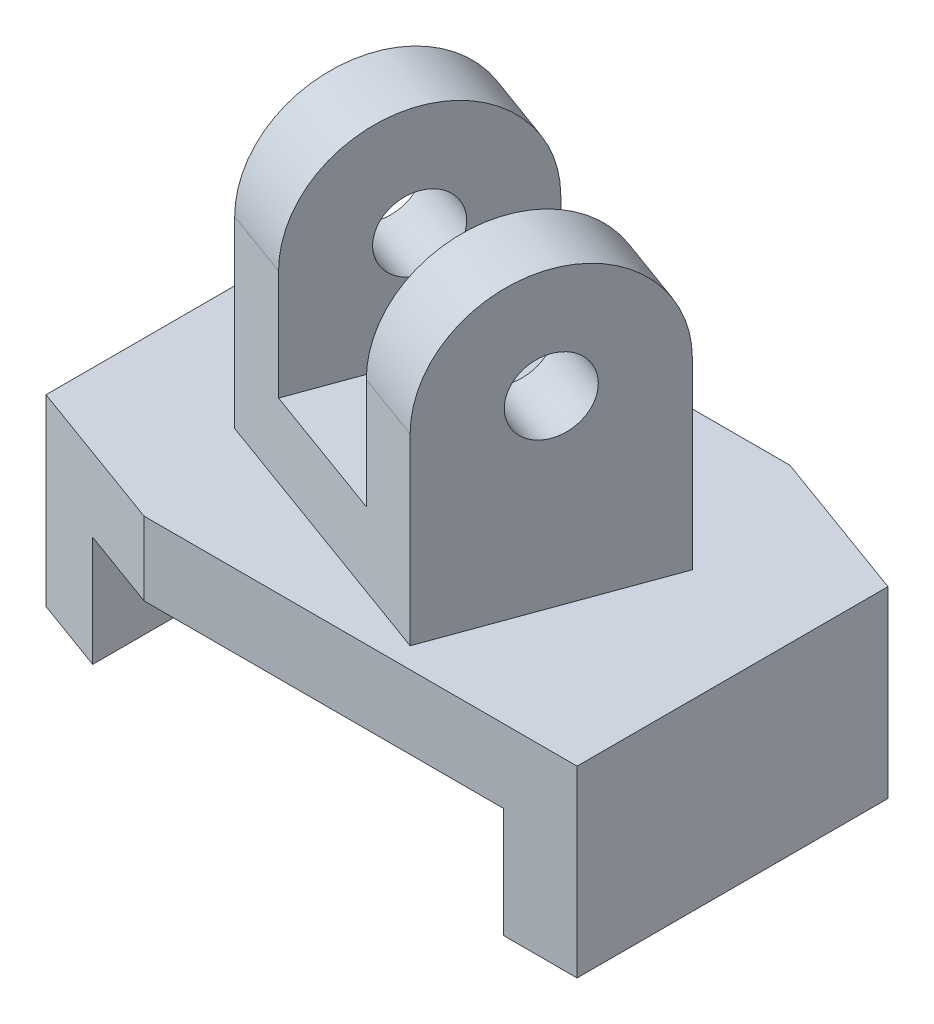
ISO-10303-21;
HEADER;
FILE_DESCRIPTION(('STEP AP214'),'2;1');
FILE_NAME('part.step','',(''),(''),'','','');
FILE_SCHEMA(('AUTOMOTIVE_DESIGN { 1 0 10303 214 1 1 1 1 }'));
ENDSEC;
DATA;
#1=APPLICATION_CONTEXT('core data for automotive mechanical design processes');
#2=APPLICATION_PROTOCOL_DEFINITION('international standard','automotive_design',2000,#1);
#3=PRODUCT_CONTEXT('',#1,'mechanical');
#4=PRODUCT('Part','Part','',(#3));
#5=PRODUCT_RELATED_PRODUCT_CATEGORY('part','',(#4));
#6=PRODUCT_DEFINITION_FORMATION('','',#4);
#7=PRODUCT_DEFINITION_CONTEXT('part definition',#1,'design');
#8=PRODUCT_DEFINITION('design','',#6,#7);
#9=PRODUCT_DEFINITION_SHAPE('','',#8);
#10=(LENGTH_UNIT() NAMED_UNIT(*) SI_UNIT(.MILLI.,.METRE.));
#11=(NAMED_UNIT(*) PLANE_ANGLE_UNIT() SI_UNIT($,.RADIAN.));
#12=(NAMED_UNIT(*) SI_UNIT($,.STERADIAN.) SOLID_ANGLE_UNIT());
#13=UNCERTAINTY_MEASURE_WITH_UNIT(LENGTH_MEASURE(1.E-05),#10,'distance_accuracy_value','');
#14=(GEOMETRIC_REPRESENTATION_CONTEXT(3) GLOBAL_UNCERTAINTY_ASSIGNED_CONTEXT((#13)) GLOBAL_UNIT_ASSIGNED_CONTEXT((#10,
#11,#12)) REPRESENTATION_CONTEXT('',''));
#15=CARTESIAN_POINT('',(0.,0.,0.));
#16=DIRECTION('',(0.,0.,1.));
#17=DIRECTION('',(1.,0.,0.));
#18=AXIS2_PLACEMENT_3D('',#15,#16,#17);
#19=CARTESIAN_POINT('',(-43.6638355049585,25.,-14.9336946815306));
#20=DIRECTION('',(0.939692620785907,0.,0.342020143325673));
#21=DIRECTION('',(0.342020143325673,0.,-0.939692620785907));
#22=AXIS2_PLACEMENT_3D('',#19,#20,#21);
#23=CYLINDRICAL_SURFACE('',#22,15.);
#24=CARTESIAN_POINT('',(-8.63546168126096,25.,-2.18440925495511));
#25=DIRECTION('',(-0.93969262078591,0.,-0.342020143325663));
#26=DIRECTION('',(-0.342020143325663,0.,0.939692620785911));
#27=AXIS2_PLACEMENT_3D('',#24,#25,#26);
#28=CIRCLE('',#27,15.);
#29=CARTESIAN_POINT('',(-3.50515953137601,25.,-16.2797985667438));
#30=VERTEX_POINT('',#29);
#31=CARTESIAN_POINT('',(-13.765763831146,25.,11.9109800568338));
#32=VERTEX_POINT('',#31);
#33=EDGE_CURVE('E203',#30,#32,#28,.F.);
#34=ORIENTED_EDGE('',*,*,#33,.F.);
#35=DIRECTION('',(0.939692620785907,0.,0.342020143325673));
#36=VECTOR('',#35,1.);
#37=CARTESIAN_POINT('',(-38.5335333550734,25.,-29.0290839933192));
#38=LINE('',#37,#36);
#39=CARTESIAN_POINT('',(-12.9020857392348,25.,-19.7000000000004));
#40=VERTEX_POINT('',#39);
#41=EDGE_CURVE('E231',#40,#30,#38,.T.);
#42=ORIENTED_EDGE('',*,*,#41,.F.);
#43=CARTESIAN_POINT('',(-18.0323878891199,25.,-5.60461068821179));
#44=DIRECTION('',(0.939692620785907,0.,0.342020143325672));
#45=DIRECTION('',(0.342020143325672,0.,-0.939692620785907));
#46=AXIS2_PLACEMENT_3D('',#43,#44,#45);
#47=CIRCLE('',#46,15.);
#48=CARTESIAN_POINT('',(-23.162690039005,25.,8.49077862357681));
#49=VERTEX_POINT('',#48);
#50=EDGE_CURVE('E240',#40,#49,#47,.T.);
#51=ORIENTED_EDGE('',*,*,#50,.T.);
#52=DIRECTION('',(0.939692620785907,0.,0.342020143325673));
#53=VECTOR('',#52,1.);
#54=CARTESIAN_POINT('',(-48.7941376548436,25.,-0.838305369741981));
#55=LINE('',#54,#53);
#56=EDGE_CURVE('E238',#49,#32,#55,.T.);
#57=ORIENTED_EDGE('',*,*,#56,.T.);
#58=EDGE_LOOP('',(#34,#42,#51,#57));
#59=FACE_BOUND('',#58,.T.);
#60=ADVANCED_FACE('F60',(#59),#23,.T.);
#61=CARTESIAN_POINT('',(-43.6638355049585,25.,-14.9336946815306));
#62=DIRECTION('',(0.939692620785907,0.,0.342020143325673));
#63=DIRECTION('',(0.342020143325673,0.,-0.939692620785907));
#64=AXIS2_PLACEMENT_3D('',#61,#62,#63);
#65=CYLINDRICAL_SURFACE('',#64,5.);
#66=CARTESIAN_POINT('',(-8.63546168126096,25.,-2.18440925495511));
#67=DIRECTION('',(-0.93969262078591,0.,-0.342020143325663));
#68=DIRECTION('',(-0.342020143325663,0.,0.939692620785911));
#69=AXIS2_PLACEMENT_3D('',#66,#67,#68);
#70=CIRCLE('',#69,5.);
#71=CARTESIAN_POINT('',(-6.92536096463264,25.,-6.88287235888466));
#72=VERTEX_POINT('',#71);
#73=EDGE_CURVE('E220',#72,#72,#70,.F.);
#74=CARTESIAN_POINT('',(-18.0323878891199,25.,-5.60461068821179));
#75=DIRECTION('',(0.939692620785907,0.,0.342020143325672));
#76=DIRECTION('',(0.342020143325672,0.,-0.939692620785907));
#77=AXIS2_PLACEMENT_3D('',#74,#75,#76);
#78=CIRCLE('',#77,5.);
#79=CARTESIAN_POINT('',(-16.3222871724915,25.,-10.3030737921413));
#80=VERTEX_POINT('',#79);
#81=EDGE_CURVE('E227',#80,#80,#78,.T.);
#82=CARTESIAN_POINT('',(-6.92536096463264,25.,-6.88287235888466));
#83=CARTESIAN_POINT('',(-7.02324561263117,25.,-6.91849945714775));
#84=CARTESIAN_POINT('',(-7.1211302606297,25.,-6.95412655541085));
#85=CARTESIAN_POINT('',(-7.31689955662676,25.,-7.02538075193703));
#86=CARTESIAN_POINT('',(-7.41478420462529,25.,-7.06100785020012));
#87=CARTESIAN_POINT('',(-7.61055350062235,25.,-7.1322620467263));
#88=CARTESIAN_POINT('',(-7.70843814862088,25.,-7.16788914498939));
#89=CARTESIAN_POINT('',(-7.90420744461794,25.,-7.23914334151557));
#90=CARTESIAN_POINT('',(-8.00209209261647,25.,-7.27477043977866));
#91=CARTESIAN_POINT('',(-8.19786138861353,25.,-7.34602463630484));
#92=CARTESIAN_POINT('',(-8.29574603661206,25.,-7.38165173456793));
#93=CARTESIAN_POINT('',(-8.49151533260912,25.,-7.45290593109411));
#94=CARTESIAN_POINT('',(-8.58939998060765,25.,-7.4885330293572));
#95=CARTESIAN_POINT('',(-8.78516927660471,25.,-7.55978722588338));
#96=CARTESIAN_POINT('',(-8.88305392460324,25.,-7.59541432414647));
#97=CARTESIAN_POINT('',(-9.0788232206003,25.,-7.66666852067265));
#98=CARTESIAN_POINT('',(-9.17670786859884,25.,-7.70229561893574));
#99=CARTESIAN_POINT('',(-9.3724771645959,25.,-7.77354981546192));
#100=CARTESIAN_POINT('',(-9.47036181259443,25.,-7.80917691372501));
#101=CARTESIAN_POINT('',(-9.66613110859148,25.,-7.88043111025119));
#102=CARTESIAN_POINT('',(-9.76401575659001,25.,-7.91605820851428));
#103=CARTESIAN_POINT('',(-9.95978505258707,25.,-7.98731240504046));
#104=CARTESIAN_POINT('',(-10.0576697005856,25.,-8.02293950330355));
#105=CARTESIAN_POINT('',(-10.2534389965827,25.,-8.09419369982973));
#106=CARTESIAN_POINT('',(-10.3513236445812,25.,-8.12982079809282));
#107=CARTESIAN_POINT('',(-10.5470929405783,25.,-8.201074994619));
#108=CARTESIAN_POINT('',(-10.6449775885768,25.,-8.23670209288209));
#109=CARTESIAN_POINT('',(-10.8407468845738,25.,-8.30795628940827));
#110=CARTESIAN_POINT('',(-10.9386315325724,25.,-8.34358338767136));
#111=CARTESIAN_POINT('',(-11.1344008285694,25.,-8.41483758419754));
#112=CARTESIAN_POINT('',(-11.232285476568,25.,-8.45046468246063));
#113=CARTESIAN_POINT('',(-11.428054772565,25.,-8.52171887898682));
#114=CARTESIAN_POINT('',(-11.5259394205636,25.,-8.55734597724991));
#115=CARTESIAN_POINT('',(-11.7217087165606,25.,-8.62860017377609));
#116=CARTESIAN_POINT('',(-11.8195933645591,25.,-8.66422727203918));
#117=CARTESIAN_POINT('',(-12.0153626605562,25.,-8.73548146856536));
#118=CARTESIAN_POINT('',(-12.1132473085547,25.,-8.77110856682845));
#119=CARTESIAN_POINT('',(-12.3090166045518,25.,-8.84236276335463));
#120=CARTESIAN_POINT('',(-12.4069012525503,25.,-8.87798986161772));
#121=CARTESIAN_POINT('',(-12.6026705485474,25.,-8.9492440581439));
#122=CARTESIAN_POINT('',(-12.7005551965459,25.,-8.98487115640699));
#123=CARTESIAN_POINT('',(-12.896324492543,25.,-9.05612535293317));
#124=CARTESIAN_POINT('',(-12.9942091405415,25.,-9.09175245119626));
#125=CARTESIAN_POINT('',(-13.1899784365386,25.,-9.16300664772244));
#126=CARTESIAN_POINT('',(-13.2878630845371,25.,-9.19863374598553));
#127=CARTESIAN_POINT('',(-13.4836323805342,25.,-9.26988794251171));
#128=CARTESIAN_POINT('',(-13.5815170285327,25.,-9.3055150407748));
#129=CARTESIAN_POINT('',(-13.7772863245297,25.,-9.37676923730098));
#130=CARTESIAN_POINT('',(-13.8751709725283,25.,-9.41239633556407));
#131=CARTESIAN_POINT('',(-14.0709402685253,25.,-9.48365053209025));
#132=CARTESIAN_POINT('',(-14.1688249165239,25.,-9.51927763035334));
#133=CARTESIAN_POINT('',(-14.3645942125209,25.,-9.59053182687952));
#134=CARTESIAN_POINT('',(-14.4624788605195,25.,-9.62615892514261));
#135=CARTESIAN_POINT('',(-14.6582481565165,25.,-9.69741312166879));
#136=CARTESIAN_POINT('',(-14.756132804515,25.,-9.73304021993188));
#137=CARTESIAN_POINT('',(-14.9519021005121,25.,-9.80429441645806));
#138=CARTESIAN_POINT('',(-15.0497867485106,25.,-9.83992151472115));
#139=CARTESIAN_POINT('',(-15.2455560445077,25.,-9.91117571124733));
#140=CARTESIAN_POINT('',(-15.3434406925062,25.,-9.94680280951042));
#141=CARTESIAN_POINT('',(-15.5392099885033,25.,-10.0180570060366));
#142=CARTESIAN_POINT('',(-15.6370946365018,25.,-10.0536841042997));
#143=CARTESIAN_POINT('',(-15.8328639324989,25.,-10.1249383008259));
#144=CARTESIAN_POINT('',(-15.9307485804974,25.,-10.160565399089));
#145=CARTESIAN_POINT('',(-16.1265178764945,25.,-10.2318195956151));
#146=CARTESIAN_POINT('',(-16.224402524493,25.,-10.2674466938782));
#147=CARTESIAN_POINT('',(-16.3222871724915,25.,-10.3030737921413));
#148=B_SPLINE_CURVE_WITH_KNOTS('',3,(#82,#83,#84,#85,#86,#87,#88,#89,#90,#91,#92,#93,#94,#95,
#96,#97,#98,#99,#100,#101,#102,#103,#104,#105,#106,#107,#108,#109,#110,#111,#112,#113,#114,#115,
#116,#117,#118,#119,#120,#121,#122,#123,#124,#125,#126,#127,#128,#129,#130,#131,#132,#133,#134,
#135,#136,#137,#138,#139,#140,#141,#142,#143,#144,#145,#146,#147),.UNSPECIFIED.,.F.,.F.,(4,2,2,
2,2,2,2,2,2,2,2,2,2,2,2,2,2,2,2,2,2,2,2,2,2,2,2,2,2,2,2,2,4),(0.,0.312499999999992,
0.624999999999984,0.937499999999975,1.24999999999997,1.56249999999996,1.87499999999996,
2.18749999999996,2.49999999999995,2.81249999999995,3.12499999999994,3.43749999999993,
3.74999999999993,4.06249999999992,4.37499999999991,4.6874999999999,4.9999999999999,
5.3124999999999,5.62499999999989,5.93749999999988,6.24999999999988,6.56249999999987,
6.87499999999986,7.18749999999985,7.49999999999985,7.81249999999985,8.12499999999984,
8.43749999999983,8.74999999999983,9.06249999999982,9.37499999999982,9.68749999999981,
9.9999999999998),.UNSPECIFIED.);
#149=EDGE_CURVE('BSEAM335',#72,#80,#148,.T.);
#150=ORIENTED_EDGE('',*,*,#73,.T.);
#151=ORIENTED_EDGE('',*,*,#81,.F.);
#152=ORIENTED_EDGE('',*,*,#149,.T.);
#153=ORIENTED_EDGE('',*,*,#149,.F.);
#154=EDGE_LOOP('',(#150,#152,#151,#153));
#155=FACE_BOUND('',#154,.T.);
#156=ADVANCED_FACE('F335',(#155),#65,.F.);
#157=CARTESIAN_POINT('',(-23.1626900390051,40.,8.49077862357721));
#158=DIRECTION('',(0.939692620785907,0.,0.342020143325672));
#159=DIRECTION('',(0.342020143325672,0.,-0.939692620785907));
#160=AXIS2_PLACEMENT_3D('',#157,#158,#159);
#161=PLANE('',#160);
#162=ORIENTED_EDGE('',*,*,#81,.T.);
#163=EDGE_LOOP('',(#162));
#164=FACE_BOUND('',#163,.T.);
#165=ORIENTED_EDGE('',*,*,#50,.F.);
#166=DIRECTION('',(0.,-1.,0.));
#167=VECTOR('',#166,1.);
#168=CARTESIAN_POINT('',(-12.9020857392349,40.,-19.7));
#169=LINE('',#168,#167);
#170=CARTESIAN_POINT('',(-12.9020857392349,0.,-19.7));
#171=VERTEX_POINT('',#170);
#172=EDGE_CURVE('E252',#40,#171,#169,.T.);
#173=ORIENTED_EDGE('',*,*,#172,.T.);
#174=DIRECTION('',(-0.342020143325672,0.,0.939692620785907));
#175=VECTOR('',#174,1.);
#176=CARTESIAN_POINT('',(-23.1626900390051,0.,8.49077862357721));
#177=LINE('',#176,#175);
#178=CARTESIAN_POINT('',(-23.1626900390051,0.,8.49077862357721));
#179=VERTEX_POINT('',#178);
#180=EDGE_CURVE('E242',#171,#179,#177,.T.);
#181=ORIENTED_EDGE('',*,*,#180,.T.);
#182=DIRECTION('',(0.,-1.,0.));
#183=VECTOR('',#182,1.);
#184=CARTESIAN_POINT('',(-23.1626900390051,40.,8.49077862357721));
#185=LINE('',#184,#183);
#186=EDGE_CURVE('E257',#49,#179,#185,.T.);
#187=ORIENTED_EDGE('',*,*,#186,.F.);
#188=EDGE_LOOP('',(#165,#173,#181,#187));
#189=FACE_BOUND('',#188,.T.);
#190=ADVANCED_FACE('F357',(#164,#189),#161,.F.);
#191=CARTESIAN_POINT('',(24.6856190922015,40.,-6.01919426697349));
#192=DIRECTION('',(-0.939692620785907,0.,-0.342020143325673));
#193=DIRECTION('',(-0.342020143325673,0.,0.939692620785907));
#194=AXIS2_PLACEMENT_3D('',#191,#192,#193);
#195=PLANE('',#194);
#196=CARTESIAN_POINT('',(19.5553169423164,25.,8.07619504481512));
#197=DIRECTION('',(0.939692620785907,0.,0.342020143325673));
#198=DIRECTION('',(0.342020143325673,0.,-0.939692620785907));
#199=AXIS2_PLACEMENT_3D('',#196,#197,#198);
#200=CIRCLE('',#199,5.);
#201=CARTESIAN_POINT('',(21.2654176589448,25.,3.37773194088559));
#202=VERTEX_POINT('',#201);
#203=EDGE_CURVE('E224',#202,#202,#200,.T.);
#204=ORIENTED_EDGE('',*,*,#203,.F.);
#205=EDGE_LOOP('',(#204));
#206=FACE_BOUND('',#205,.T.);
#207=DIRECTION('',(0.,-1.,0.));
#208=VECTOR('',#207,1.);
#209=CARTESIAN_POINT('',(24.6856190922015,40.,-6.01919426697349));
#210=LINE('',#209,#208);
#211=CARTESIAN_POINT('',(24.6856190922015,25.,-6.01919426697349));
#212=VERTEX_POINT('',#211);
#213=CARTESIAN_POINT('',(24.6856190922015,0.,-6.01919426697349));
#214=VERTEX_POINT('',#213);
#215=EDGE_CURVE('E75',#212,#214,#210,.T.);
#216=ORIENTED_EDGE('',*,*,#215,.F.);
#217=CARTESIAN_POINT('',(19.5553169423164,25.,8.07619504481512));
#218=DIRECTION('',(0.939692620785907,0.,0.342020143325673));
#219=DIRECTION('',(0.342020143325673,0.,-0.939692620785907));
#220=AXIS2_PLACEMENT_3D('',#217,#218,#219);
#221=CIRCLE('',#220,15.);
#222=CARTESIAN_POINT('',(14.4250147924313,25.,22.1715843566037));
#223=VERTEX_POINT('',#222);
#224=EDGE_CURVE('E234',#212,#223,#221,.T.);
#225=ORIENTED_EDGE('',*,*,#224,.T.);
#226=DIRECTION('',(0.,-1.,0.));
#227=VECTOR('',#226,1.);
#228=CARTESIAN_POINT('',(14.4250147924313,40.,22.1715843566037));
#229=LINE('',#228,#227);
#230=CARTESIAN_POINT('',(14.4250147924313,0.,22.1715843566037));
#231=VERTEX_POINT('',#230);
#232=EDGE_CURVE('E255',#223,#231,#229,.T.);
#233=ORIENTED_EDGE('',*,*,#232,.T.);
#234=DIRECTION('',(0.342020143325673,0.,-0.939692620785907));
#235=VECTOR('',#234,1.);
#236=CARTESIAN_POINT('',(24.6856190922015,0.,-6.01919426697349));
#237=LINE('',#236,#235);
#238=EDGE_CURVE('E248',#231,#214,#237,.T.);
#239=ORIENTED_EDGE('',*,*,#238,.T.);
#240=EDGE_LOOP('',(#216,#225,#233,#239));
#241=FACE_BOUND('',#240,.T.);
#242=ADVANCED_FACE('F376',(#206,#241),#195,.F.);
#243=CARTESIAN_POINT('',(14.4250147924313,40.,22.1715843566037));
#244=DIRECTION('',(0.342020143325663,0.,-0.93969262078591));
#245=DIRECTION('',(-0.939692620785911,0.,-0.342020143325663));
#246=AXIS2_PLACEMENT_3D('',#243,#244,#245);
#247=PLANE('',#246);
#248=DIRECTION('',(0.93969262078591,0.,0.342020143325663));
#249=VECTOR('',#248,1.);
#250=CARTESIAN_POINT('',(-13.765763831146,10.,11.9109800568338));
#251=LINE('',#250,#249);
#252=CARTESIAN_POINT('',(-13.765763831146,10.,11.9109800568338));
#253=VERTEX_POINT('',#252);
#254=CARTESIAN_POINT('',(5.0280885845722,10.,18.7513829233471));
#255=VERTEX_POINT('',#254);
#256=EDGE_CURVE('E192',#253,#255,#251,.T.);
#257=ORIENTED_EDGE('',*,*,#256,.F.);
#258=DIRECTION('',(0.,-1.,0.));
#259=VECTOR('',#258,1.);
#260=CARTESIAN_POINT('',(-13.765763831146,40.,11.9109800568338));
#261=LINE('',#260,#259);
#262=EDGE_CURVE('E201',#32,#253,#261,.T.);
#263=ORIENTED_EDGE('',*,*,#262,.F.);
#264=ORIENTED_EDGE('',*,*,#56,.F.);
#265=ORIENTED_EDGE('',*,*,#186,.T.);
#266=DIRECTION('',(0.93969262078591,0.,0.342020143325663));
#267=VECTOR('',#266,1.);
#268=CARTESIAN_POINT('',(14.4250147924313,0.,22.1715843566037));
#269=LINE('',#268,#267);
#270=EDGE_CURVE('E245',#179,#231,#269,.T.);
#271=ORIENTED_EDGE('',*,*,#270,.T.);
#272=ORIENTED_EDGE('',*,*,#232,.F.);
#273=CARTESIAN_POINT('',(5.0280885845722,25.,18.7513829233471));
#274=VERTEX_POINT('',#273);
#275=EDGE_CURVE('E237',#274,#223,#55,.T.);
#276=ORIENTED_EDGE('',*,*,#275,.F.);
#277=DIRECTION('',(0.,1.,0.));
#278=VECTOR('',#277,1.);
#279=CARTESIAN_POINT('',(5.02808858457219,40.,18.7513829233471));
#280=LINE('',#279,#278);
#281=EDGE_CURVE('E198',#255,#274,#280,.T.);
#282=ORIENTED_EDGE('',*,*,#281,.F.);
#283=EDGE_LOOP('',(#257,#263,#264,#265,#271,#272,#276,#282));
#284=FACE_BOUND('',#283,.T.);
#285=ADVANCED_FACE('F208',(#284),#247,.F.);
#286=CARTESIAN_POINT('',(0.,0.,0.));
#287=DIRECTION('',(0.,1.,0.));
#288=DIRECTION('',(0.,0.,1.));
#289=AXIS2_PLACEMENT_3D('',#286,#287,#288);
#290=PLANE('',#289);
#291=DIRECTION('',(0.,0.,1.));
#292=VECTOR('',#291,1.);
#293=CARTESIAN_POINT('',(-40.,0.,-25.));
#294=LINE('',#293,#292);
#295=CARTESIAN_POINT('',(-40.,0.,-25.));
#296=VERTEX_POINT('',#295);
#297=CARTESIAN_POINT('',(-40.,0.,17.3566250804099));
#298=VERTEX_POINT('',#297);
#299=EDGE_CURVE('E281',#296,#298,#294,.T.);
#300=ORIENTED_EDGE('',*,*,#299,.T.);
#301=DIRECTION('',(0.939692620785911,0.,0.342020143325663));
#302=VECTOR('',#301,1.);
#303=CARTESIAN_POINT('',(-19.,0.,25.));
#304=LINE('',#303,#302);
#305=CARTESIAN_POINT('',(-19.,0.,25.));
#306=VERTEX_POINT('',#305);
#307=EDGE_CURVE('E302',#298,#306,#304,.T.);
#308=ORIENTED_EDGE('',*,*,#307,.T.);
#309=DIRECTION('',(1.,0.,0.));
#310=VECTOR('',#309,1.);
#311=CARTESIAN_POINT('',(-19.,0.,25.));
#312=LINE('',#311,#310);
#313=CARTESIAN_POINT('',(40.,0.,25.));
#314=VERTEX_POINT('',#313);
#315=EDGE_CURVE('E305',#306,#314,#312,.T.);
#316=ORIENTED_EDGE('',*,*,#315,.T.);
#317=DIRECTION('',(0.,0.,-1.));
#318=VECTOR('',#317,1.);
#319=CARTESIAN_POINT('',(40.,0.,-17.3566250804097));
#320=LINE('',#319,#318);
#321=CARTESIAN_POINT('',(40.,0.,-17.3566250804097));
#322=VERTEX_POINT('',#321);
#323=EDGE_CURVE('E308',#314,#322,#320,.T.);
#324=ORIENTED_EDGE('',*,*,#323,.T.);
#325=DIRECTION('',(-0.939692620785908,0.,-0.342020143325669));
#326=VECTOR('',#325,1.);
#327=CARTESIAN_POINT('',(19.,0.,-25.));
#328=LINE('',#327,#326);
#329=CARTESIAN_POINT('',(19.,0.,-25.));
#330=VERTEX_POINT('',#329);
#331=EDGE_CURVE('E311',#322,#330,#328,.T.);
#332=ORIENTED_EDGE('',*,*,#331,.T.);
#333=DIRECTION('',(-1.,0.,0.));
#334=VECTOR('',#333,1.);
#335=CARTESIAN_POINT('',(-40.,0.,-25.));
#336=LINE('',#335,#334);
#337=EDGE_CURVE('E286',#330,#296,#336,.T.);
#338=ORIENTED_EDGE('',*,*,#337,.T.);
#339=EDGE_LOOP('',(#300,#308,#316,#324,#332,#338));
#340=FACE_BOUND('',#339,.T.);
#341=ORIENTED_EDGE('',*,*,#270,.F.);
#342=ORIENTED_EDGE('',*,*,#180,.F.);
#343=DIRECTION('',(-0.939692620785911,0.,-0.342020143325663));
#344=VECTOR('',#343,1.);
#345=CARTESIAN_POINT('',(-12.9020857392349,0.,-19.7));
#346=LINE('',#345,#344);
#347=EDGE_CURVE('E250',#214,#171,#346,.T.);
#348=ORIENTED_EDGE('',*,*,#347,.F.);
#349=ORIENTED_EDGE('',*,*,#238,.F.);
#350=EDGE_LOOP('',(#341,#342,#348,#349));
#351=FACE_BOUND('',#350,.T.);
#352=ADVANCED_FACE('F380',(#340,#351),#290,.T.);
#353=CARTESIAN_POINT('',(0.,-25.,0.));
#354=DIRECTION('',(0.,1.,0.));
#355=DIRECTION('',(0.,0.,1.));
#356=AXIS2_PLACEMENT_3D('',#353,#354,#355);
#357=PLANE('',#356);
#358=DIRECTION('',(1.,0.,0.));
#359=VECTOR('',#358,1.);
#360=CARTESIAN_POINT('',(-19.,-25.,25.));
#361=LINE('',#360,#359);
#362=CARTESIAN_POINT('',(30.,-25.,25.));
#363=VERTEX_POINT('',#362);
#364=CARTESIAN_POINT('',(40.,-25.,25.));
#365=VERTEX_POINT('',#364);
#366=EDGE_CURVE('E289',#363,#365,#361,.T.);
#367=ORIENTED_EDGE('',*,*,#366,.F.);
#368=DIRECTION('',(0.,0.,-1.));
#369=VECTOR('',#368,1.);
#370=CARTESIAN_POINT('',(30.,-25.,0.));
#371=LINE('',#370,#369);
#372=CARTESIAN_POINT('',(30.,-25.,-20.9963274230718));
#373=VERTEX_POINT('',#372);
#374=EDGE_CURVE('E318',#363,#373,#371,.T.);
#375=ORIENTED_EDGE('',*,*,#374,.T.);
#376=DIRECTION('',(-0.939692620785908,0.,-0.342020143325669));
#377=VECTOR('',#376,1.);
#378=CARTESIAN_POINT('',(19.,-25.,-25.));
#379=LINE('',#378,#377);
#380=CARTESIAN_POINT('',(40.,-25.,-17.3566250804097));
#381=VERTEX_POINT('',#380);
#382=EDGE_CURVE('E294',#381,#373,#379,.T.);
#383=ORIENTED_EDGE('',*,*,#382,.F.);
#384=DIRECTION('',(0.,0.,-1.));
#385=VECTOR('',#384,1.);
#386=CARTESIAN_POINT('',(40.,-25.,-17.3566250804097));
#387=LINE('',#386,#385);
#388=EDGE_CURVE('E291',#365,#381,#387,.T.);
#389=ORIENTED_EDGE('',*,*,#388,.F.);
#390=EDGE_LOOP('',(#367,#375,#383,#389));
#391=FACE_BOUND('',#390,.T.);
#392=ADVANCED_FACE('F410',(#391),#357,.F.);
#393=CARTESIAN_POINT('',(-40.,-25.,-25.));
#394=DIRECTION('',(-1.,0.,0.));
#395=DIRECTION('',(0.,0.,1.));
#396=AXIS2_PLACEMENT_3D('',#393,#394,#395);
#397=PLANE('',#396);
#398=ORIENTED_EDGE('',*,*,#299,.F.);
#399=DIRECTION('',(0.,1.,0.));
#400=VECTOR('',#399,1.);
#401=CARTESIAN_POINT('',(-40.,-25.,-25.));
#402=LINE('',#401,#400);
#403=CARTESIAN_POINT('',(-40.,-25.,-25.));
#404=VERTEX_POINT('',#403);
#405=EDGE_CURVE('E316',#404,#296,#402,.T.);
#406=ORIENTED_EDGE('',*,*,#405,.F.);
#407=DIRECTION('',(0.,0.,1.));
#408=VECTOR('',#407,1.);
#409=CARTESIAN_POINT('',(-40.,-25.,-25.));
#410=LINE('',#409,#408);
#411=CARTESIAN_POINT('',(-40.,-25.,17.3566250804099));
#412=VERTEX_POINT('',#411);
#413=EDGE_CURVE('E282',#404,#412,#410,.T.);
#414=ORIENTED_EDGE('',*,*,#413,.T.);
#415=DIRECTION('',(0.,1.,0.));
#416=VECTOR('',#415,1.);
#417=CARTESIAN_POINT('',(-40.,-25.,17.3566250804099));
#418=LINE('',#417,#416);
#419=EDGE_CURVE('E299',#412,#298,#418,.T.);
#420=ORIENTED_EDGE('',*,*,#419,.T.);
#421=EDGE_LOOP('',(#398,#406,#414,#420));
#422=FACE_BOUND('',#421,.T.);
#423=ADVANCED_FACE('F62',(#422),#397,.T.);
#424=CARTESIAN_POINT('',(-40.,-25.,-25.));
#425=DIRECTION('',(0.,0.,-1.));
#426=DIRECTION('',(-1.,0.,0.));
#427=AXIS2_PLACEMENT_3D('',#424,#425,#426);
#428=PLANE('',#427);
#429=DIRECTION('',(0.,-1.,0.));
#430=VECTOR('',#429,1.);
#431=CARTESIAN_POINT('',(-30.,-25.,-25.));
#432=LINE('',#431,#430);
#433=CARTESIAN_POINT('',(-30.,-10.,-25.));
#434=VERTEX_POINT('',#433);
#435=CARTESIAN_POINT('',(-30.,-25.,-25.));
#436=VERTEX_POINT('',#435);
#437=EDGE_CURVE('E263',#434,#436,#432,.T.);
#438=ORIENTED_EDGE('',*,*,#437,.T.);
#439=DIRECTION('',(-1.,0.,0.));
#440=VECTOR('',#439,1.);
#441=CARTESIAN_POINT('',(-40.,-25.,-25.));
#442=LINE('',#441,#440);
#443=EDGE_CURVE('E297',#436,#404,#442,.T.);
#444=ORIENTED_EDGE('',*,*,#443,.T.);
#445=ORIENTED_EDGE('',*,*,#405,.T.);
#446=ORIENTED_EDGE('',*,*,#337,.F.);
#447=DIRECTION('',(0.,1.,0.));
#448=VECTOR('',#447,1.);
#449=CARTESIAN_POINT('',(19.,-25.,-25.));
#450=LINE('',#449,#448);
#451=CARTESIAN_POINT('',(19.,-10.,-25.));
#452=VERTEX_POINT('',#451);
#453=EDGE_CURVE('E319',#452,#330,#450,.T.);
#454=ORIENTED_EDGE('',*,*,#453,.F.);
#455=DIRECTION('',(-1.,0.,0.));
#456=VECTOR('',#455,1.);
#457=CARTESIAN_POINT('',(30.,-10.,-25.));
#458=LINE('',#457,#456);
#459=EDGE_CURVE('E260',#452,#434,#458,.T.);
#460=ORIENTED_EDGE('',*,*,#459,.T.);
#461=EDGE_LOOP('',(#438,#444,#445,#446,#454,#460));
#462=FACE_BOUND('',#461,.T.);
#463=ADVANCED_FACE('F414',(#462),#428,.T.);
#464=CARTESIAN_POINT('',(19.,-25.,-25.));
#465=DIRECTION('',(0.342020143325669,0.,-0.939692620785908));
#466=DIRECTION('',(-0.939692620785908,0.,-0.342020143325669));
#467=AXIS2_PLACEMENT_3D('',#464,#465,#466);
#468=PLANE('',#467);
#469=DIRECTION('',(0.,-1.,0.));
#470=VECTOR('',#469,1.);
#471=CARTESIAN_POINT('',(30.,-25.,-20.9963274230718));
#472=LINE('',#471,#470);
#473=CARTESIAN_POINT('',(30.,-10.,-20.9963274230718));
#474=VERTEX_POINT('',#473);
#475=EDGE_CURVE('E277',#474,#373,#472,.T.);
#476=ORIENTED_EDGE('',*,*,#475,.F.);
#477=DIRECTION('',(0.939692620785908,0.,0.342020143325669));
#478=VECTOR('',#477,1.);
#479=CARTESIAN_POINT('',(19.,-10.,-25.));
#480=LINE('',#479,#478);
#481=EDGE_CURVE('E279',#452,#474,#480,.T.);
#482=ORIENTED_EDGE('',*,*,#481,.F.);
#483=ORIENTED_EDGE('',*,*,#453,.T.);
#484=ORIENTED_EDGE('',*,*,#331,.F.);
#485=DIRECTION('',(0.,1.,0.));
#486=VECTOR('',#485,1.);
#487=CARTESIAN_POINT('',(40.,-25.,-17.3566250804097));
#488=LINE('',#487,#486);
#489=EDGE_CURVE('E321',#381,#322,#488,.T.);
#490=ORIENTED_EDGE('',*,*,#489,.F.);
#491=ORIENTED_EDGE('',*,*,#382,.T.);
#492=EDGE_LOOP('',(#476,#482,#483,#484,#490,#491));
#493=FACE_BOUND('',#492,.T.);
#494=ADVANCED_FACE('F417',(#493),#468,.T.);
#495=CARTESIAN_POINT('',(40.,-25.,-17.3566250804097));
#496=DIRECTION('',(1.,0.,0.));
#497=DIRECTION('',(0.,0.,-1.));
#498=AXIS2_PLACEMENT_3D('',#495,#496,#497);
#499=PLANE('',#498);
#500=ORIENTED_EDGE('',*,*,#323,.F.);
#501=DIRECTION('',(0.,1.,0.));
#502=VECTOR('',#501,1.);
#503=CARTESIAN_POINT('',(40.,-25.,25.));
#504=LINE('',#503,#502);
#505=EDGE_CURVE('E323',#365,#314,#504,.T.);
#506=ORIENTED_EDGE('',*,*,#505,.F.);
#507=ORIENTED_EDGE('',*,*,#388,.T.);
#508=ORIENTED_EDGE('',*,*,#489,.T.);
#509=EDGE_LOOP('',(#500,#506,#507,#508));
#510=FACE_BOUND('',#509,.T.);
#511=ADVANCED_FACE('F421',(#510),#499,.T.);
#512=CARTESIAN_POINT('',(-19.,-25.,25.));
#513=DIRECTION('',(0.,0.,1.));
#514=DIRECTION('',(1.,0.,0.));
#515=AXIS2_PLACEMENT_3D('',#512,#513,#514);
#516=PLANE('',#515);
#517=DIRECTION('',(0.,1.,0.));
#518=VECTOR('',#517,1.);
#519=CARTESIAN_POINT('',(30.,-25.,25.));
#520=LINE('',#519,#518);
#521=CARTESIAN_POINT('',(30.,-10.,25.));
#522=VERTEX_POINT('',#521);
#523=EDGE_CURVE('E259',#363,#522,#520,.T.);
#524=ORIENTED_EDGE('',*,*,#523,.F.);
#525=ORIENTED_EDGE('',*,*,#366,.T.);
#526=ORIENTED_EDGE('',*,*,#505,.T.);
#527=ORIENTED_EDGE('',*,*,#315,.F.);
#528=DIRECTION('',(0.,1.,0.));
#529=VECTOR('',#528,1.);
#530=CARTESIAN_POINT('',(-19.,-25.,25.));
#531=LINE('',#530,#529);
#532=CARTESIAN_POINT('',(-19.,-10.,25.));
#533=VERTEX_POINT('',#532);
#534=EDGE_CURVE('E325',#533,#306,#531,.T.);
#535=ORIENTED_EDGE('',*,*,#534,.F.);
#536=DIRECTION('',(-1.,0.,0.));
#537=VECTOR('',#536,1.);
#538=CARTESIAN_POINT('',(30.,-10.,25.));
#539=LINE('',#538,#537);
#540=EDGE_CURVE('E264',#522,#533,#539,.T.);
#541=ORIENTED_EDGE('',*,*,#540,.F.);
#542=EDGE_LOOP('',(#524,#525,#526,#527,#535,#541));
#543=FACE_BOUND('',#542,.T.);
#544=ADVANCED_FACE('F425',(#543),#516,.T.);
#545=CARTESIAN_POINT('',(-19.,-25.,25.));
#546=DIRECTION('',(-0.342020143325663,0.,0.93969262078591));
#547=DIRECTION('',(0.939692620785911,0.,0.342020143325663));
#548=AXIS2_PLACEMENT_3D('',#545,#546,#547);
#549=PLANE('',#548);
#550=DIRECTION('',(0.,-1.,0.));
#551=VECTOR('',#550,1.);
#552=CARTESIAN_POINT('',(-30.,-25.,20.9963274230719));
#553=LINE('',#552,#551);
#554=CARTESIAN_POINT('',(-30.,-10.,20.9963274230719));
#555=VERTEX_POINT('',#554);
#556=CARTESIAN_POINT('',(-30.,-25.,20.9963274230719));
#557=VERTEX_POINT('',#556);
#558=EDGE_CURVE('E83',#555,#557,#553,.T.);
#559=ORIENTED_EDGE('',*,*,#558,.F.);
#560=DIRECTION('',(-0.939692620785911,0.,-0.342020143325663));
#561=VECTOR('',#560,1.);
#562=CARTESIAN_POINT('',(-19.,-10.,25.));
#563=LINE('',#562,#561);
#564=EDGE_CURVE('E68',#533,#555,#563,.T.);
#565=ORIENTED_EDGE('',*,*,#564,.F.);
#566=ORIENTED_EDGE('',*,*,#534,.T.);
#567=ORIENTED_EDGE('',*,*,#307,.F.);
#568=ORIENTED_EDGE('',*,*,#419,.F.);
#569=DIRECTION('',(0.939692620785911,0.,0.342020143325663));
#570=VECTOR('',#569,1.);
#571=CARTESIAN_POINT('',(-19.,-25.,25.));
#572=LINE('',#571,#570);
#573=EDGE_CURVE('E285',#412,#557,#572,.T.);
#574=ORIENTED_EDGE('',*,*,#573,.T.);
#575=EDGE_LOOP('',(#559,#565,#566,#567,#568,#574));
#576=FACE_BOUND('',#575,.T.);
#577=ADVANCED_FACE('F408',(#576),#549,.T.);
#578=ORIENTED_EDGE('',*,*,#443,.F.);
#579=DIRECTION('',(0.,0.,1.));
#580=VECTOR('',#579,1.);
#581=CARTESIAN_POINT('',(-30.,-25.,-25.));
#582=LINE('',#581,#580);
#583=EDGE_CURVE('E271',#436,#557,#582,.T.);
#584=ORIENTED_EDGE('',*,*,#583,.T.);
#585=ORIENTED_EDGE('',*,*,#573,.F.);
#586=ORIENTED_EDGE('',*,*,#413,.F.);
#587=EDGE_LOOP('',(#578,#584,#585,#586));
#588=FACE_BOUND('',#587,.T.);
#589=ADVANCED_FACE('F404',(#588),#357,.F.);
#590=CARTESIAN_POINT('',(30.,-25.,-25.));
#591=DIRECTION('',(1.,0.,0.));
#592=DIRECTION('',(0.,1.,0.));
#593=AXIS2_PLACEMENT_3D('',#590,#591,#592);
#594=PLANE('',#593);
#595=ORIENTED_EDGE('',*,*,#475,.T.);
#596=ORIENTED_EDGE('',*,*,#374,.F.);
#597=ORIENTED_EDGE('',*,*,#523,.T.);
#598=DIRECTION('',(0.,0.,1.));
#599=VECTOR('',#598,1.);
#600=CARTESIAN_POINT('',(30.,-10.,-25.));
#601=LINE('',#600,#599);
#602=EDGE_CURVE('E267',#474,#522,#601,.T.);
#603=ORIENTED_EDGE('',*,*,#602,.F.);
#604=EDGE_LOOP('',(#595,#596,#597,#603));
#605=FACE_BOUND('',#604,.T.);
#606=ADVANCED_FACE('F398',(#605),#594,.F.);
#607=CARTESIAN_POINT('',(-30.,-25.,-25.));
#608=DIRECTION('',(-1.,0.,0.));
#609=DIRECTION('',(0.,-1.,0.));
#610=AXIS2_PLACEMENT_3D('',#607,#608,#609);
#611=PLANE('',#610);
#612=ORIENTED_EDGE('',*,*,#558,.T.);
#613=ORIENTED_EDGE('',*,*,#583,.F.);
#614=ORIENTED_EDGE('',*,*,#437,.F.);
#615=DIRECTION('',(0.,0.,1.));
#616=VECTOR('',#615,1.);
#617=CARTESIAN_POINT('',(-30.,-10.,-25.));
#618=LINE('',#617,#616);
#619=EDGE_CURVE('E273',#434,#555,#618,.T.);
#620=ORIENTED_EDGE('',*,*,#619,.T.);
#621=EDGE_LOOP('',(#612,#613,#614,#620));
#622=FACE_BOUND('',#621,.T.);
#623=ADVANCED_FACE('F395',(#622),#611,.F.);
#624=CARTESIAN_POINT('',(30.,-10.,-25.));
#625=DIRECTION('',(0.,1.,0.));
#626=DIRECTION('',(-1.,0.,0.));
#627=AXIS2_PLACEMENT_3D('',#624,#625,#626);
#628=PLANE('',#627);
#629=ORIENTED_EDGE('',*,*,#481,.T.);
#630=ORIENTED_EDGE('',*,*,#602,.T.);
#631=ORIENTED_EDGE('',*,*,#540,.T.);
#632=ORIENTED_EDGE('',*,*,#564,.T.);
#633=ORIENTED_EDGE('',*,*,#619,.F.);
#634=ORIENTED_EDGE('',*,*,#459,.F.);
#635=EDGE_LOOP('',(#629,#630,#631,#632,#633,#634));
#636=FACE_BOUND('',#635,.T.);
#637=ADVANCED_FACE('F367',(#636),#628,.F.);
#638=CARTESIAN_POINT('',(-12.9020857392349,40.,-19.7));
#639=DIRECTION('',(-0.342020143325663,0.,0.939692620785911));
#640=DIRECTION('',(0.939692620785911,0.,0.342020143325663));
#641=AXIS2_PLACEMENT_3D('',#638,#639,#640);
#642=PLANE('',#641);
#643=ORIENTED_EDGE('',*,*,#41,.T.);
#644=DIRECTION('',(0.,-1.,0.));
#645=VECTOR('',#644,1.);
#646=CARTESIAN_POINT('',(-3.50515953137612,40.,-16.2797985667435));
#647=LINE('',#646,#645);
#648=CARTESIAN_POINT('',(-3.50515953137612,10.,-16.2797985667435));
#649=VERTEX_POINT('',#648);
#650=EDGE_CURVE('E222',#30,#649,#647,.T.);
#651=ORIENTED_EDGE('',*,*,#650,.T.);
#652=DIRECTION('',(0.939692620785911,0.,0.342020143325663));
#653=VECTOR('',#652,1.);
#654=CARTESIAN_POINT('',(-12.9020857392349,10.,-19.7));
#655=LINE('',#654,#653);
#656=CARTESIAN_POINT('',(15.2886928843421,10.,-9.43939570023022));
#657=VERTEX_POINT('',#656);
#658=EDGE_CURVE('E12',#649,#657,#655,.T.);
#659=ORIENTED_EDGE('',*,*,#658,.T.);
#660=DIRECTION('',(0.,1.,0.));
#661=VECTOR('',#660,1.);
#662=CARTESIAN_POINT('',(15.2886928843421,40.,-9.43939570023022));
#663=LINE('',#662,#661);
#664=CARTESIAN_POINT('',(15.2886928843421,25.,-9.43939570023032));
#665=VERTEX_POINT('',#664);
#666=EDGE_CURVE('E217',#657,#665,#663,.T.);
#667=ORIENTED_EDGE('',*,*,#666,.T.);
#668=EDGE_CURVE('E230',#665,#212,#38,.T.);
#669=ORIENTED_EDGE('',*,*,#668,.T.);
#670=ORIENTED_EDGE('',*,*,#215,.T.);
#671=ORIENTED_EDGE('',*,*,#347,.T.);
#672=ORIENTED_EDGE('',*,*,#172,.F.);
#673=EDGE_LOOP('',(#643,#651,#659,#667,#669,#670,#671,#672));
#674=FACE_BOUND('',#673,.T.);
#675=ADVANCED_FACE('F360',(#674),#642,.F.);
#676=CARTESIAN_POINT('',(10.1583907344572,25.,4.65599361155834));
#677=DIRECTION('',(0.93969262078591,0.,0.342020143325663));
#678=DIRECTION('',(0.342020143325663,0.,-0.939692620785911));
#679=AXIS2_PLACEMENT_3D('',#676,#677,#678);
#680=CIRCLE('',#679,15.);
#681=EDGE_CURVE('E215',#274,#665,#680,.F.);
#682=ORIENTED_EDGE('',*,*,#681,.F.);
#683=ORIENTED_EDGE('',*,*,#275,.T.);
#684=ORIENTED_EDGE('',*,*,#224,.F.);
#685=ORIENTED_EDGE('',*,*,#668,.F.);
#686=EDGE_LOOP('',(#682,#683,#684,#685));
#687=FACE_BOUND('',#686,.T.);
#688=ADVANCED_FACE('F353',(#687),#23,.T.);
#689=CARTESIAN_POINT('',(10.1583907344572,25.,4.65599361155834));
#690=DIRECTION('',(0.93969262078591,0.,0.342020143325663));
#691=DIRECTION('',(0.342020143325663,0.,-0.939692620785911));
#692=AXIS2_PLACEMENT_3D('',#689,#690,#691);
#693=CIRCLE('',#692,5.);
#694=CARTESIAN_POINT('',(11.8684914510855,25.,-0.042469492371214));
#695=VERTEX_POINT('',#694);
#696=EDGE_CURVE('E213',#695,#695,#693,.F.);
#697=ORIENTED_EDGE('',*,*,#696,.T.);
#698=EDGE_LOOP('',(#697));
#699=FACE_BOUND('',#698,.T.);
#700=ORIENTED_EDGE('',*,*,#203,.T.);
#701=EDGE_LOOP('',(#700));
#702=FACE_BOUND('',#701,.T.);
#703=ADVANCED_FACE('F347',(#699,#702),#65,.F.);
#704=CARTESIAN_POINT('',(-0.0849580981194895,10.,-25.6767247746026));
#705=DIRECTION('',(0.,-1.,0.));
#706=DIRECTION('',(0.,0.,-1.));
#707=AXIS2_PLACEMENT_3D('',#704,#705,#706);
#708=PLANE('',#707);
#709=DIRECTION('',(-0.342020143325663,0.,0.93969262078591));
#710=VECTOR('',#709,1.);
#711=CARTESIAN_POINT('',(-0.0849580981194895,10.,-25.6767247746026));
#712=LINE('',#711,#710);
#713=EDGE_CURVE('E187',#649,#253,#712,.T.);
#714=ORIENTED_EDGE('',*,*,#713,.T.);
#715=ORIENTED_EDGE('',*,*,#256,.T.);
#716=DIRECTION('',(-0.342020143325663,0.,0.93969262078591));
#717=VECTOR('',#716,1.);
#718=CARTESIAN_POINT('',(18.7088943175987,10.,-18.8363219080893));
#719=LINE('',#718,#717);
#720=EDGE_CURVE('E197',#657,#255,#719,.T.);
#721=ORIENTED_EDGE('',*,*,#720,.F.);
#722=ORIENTED_EDGE('',*,*,#658,.F.);
#723=EDGE_LOOP('',(#714,#715,#721,#722));
#724=FACE_BOUND('',#723,.T.);
#725=ADVANCED_FACE('F189',(#724),#708,.F.);
#726=CARTESIAN_POINT('',(-0.0849580981194913,40.,-25.6767247746026));
#727=DIRECTION('',(-0.93969262078591,0.,-0.342020143325663));
#728=DIRECTION('',(-0.342020143325663,0.,0.939692620785911));
#729=AXIS2_PLACEMENT_3D('',#726,#727,#728);
#730=PLANE('',#729);
#731=ORIENTED_EDGE('',*,*,#73,.F.);
#732=EDGE_LOOP('',(#731));
#733=FACE_BOUND('',#732,.T.);
#734=ORIENTED_EDGE('',*,*,#650,.F.);
#735=ORIENTED_EDGE('',*,*,#33,.T.);
#736=ORIENTED_EDGE('',*,*,#262,.T.);
#737=ORIENTED_EDGE('',*,*,#713,.F.);
#738=EDGE_LOOP('',(#734,#735,#736,#737));
#739=FACE_BOUND('',#738,.T.);
#740=ADVANCED_FACE('F202',(#733,#739),#730,.F.);
#741=CARTESIAN_POINT('',(18.7088943175987,40.,-18.8363219080893));
#742=DIRECTION('',(0.93969262078591,0.,0.342020143325663));
#743=DIRECTION('',(0.342020143325663,0.,-0.939692620785911));
#744=AXIS2_PLACEMENT_3D('',#741,#742,#743);
#745=PLANE('',#744);
#746=ORIENTED_EDGE('',*,*,#696,.F.);
#747=EDGE_LOOP('',(#746));
#748=FACE_BOUND('',#747,.T.);
#749=ORIENTED_EDGE('',*,*,#720,.T.);
#750=ORIENTED_EDGE('',*,*,#281,.T.);
#751=ORIENTED_EDGE('',*,*,#681,.T.);
#752=ORIENTED_EDGE('',*,*,#666,.F.);
#753=EDGE_LOOP('',(#749,#750,#751,#752));
#754=FACE_BOUND('',#753,.T.);
#755=ADVANCED_FACE('F339',(#748,#754),#745,.F.);
#756=CLOSED_SHELL('',(#60,#156,#190,#242,#285,#352,#392,#423,#463,#494,#511,#544,#577,#589,#606,
#623,#637,#675,#688,#703,#725,#740,#755));
#757=MANIFOLD_SOLID_BREP('B2',#756);
#758=ADVANCED_BREP_SHAPE_REPRESENTATION('',(#18,#757),#14);
#759=SHAPE_DEFINITION_REPRESENTATION(#9,#758);
ENDSEC;
END-ISO-10303-21;
